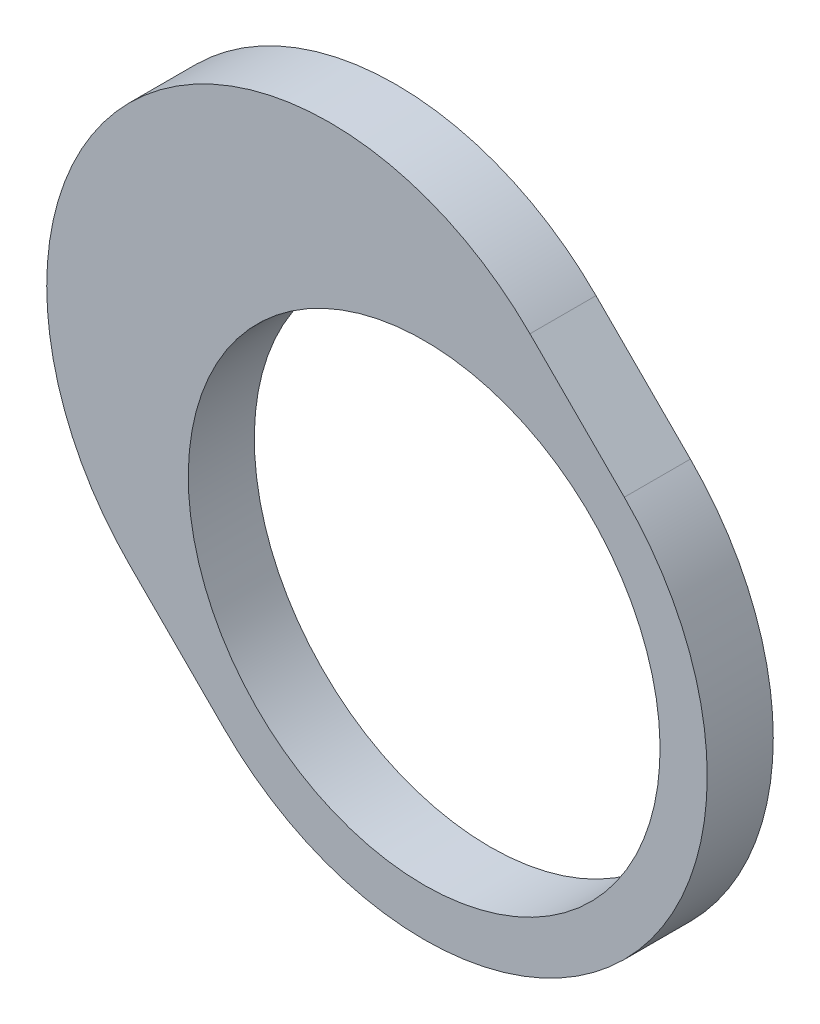
ISO-10303-21;
HEADER;
FILE_DESCRIPTION(('STEP AP214'),'2;1');
FILE_NAME('part.step','',(''),(''),'','','');
FILE_SCHEMA(('AUTOMOTIVE_DESIGN { 1 0 10303 214 1 1 1 1 }'));
ENDSEC;
DATA;
#1=APPLICATION_CONTEXT('core data for automotive mechanical design processes');
#2=APPLICATION_PROTOCOL_DEFINITION('international standard','automotive_design',2000,#1);
#3=PRODUCT_CONTEXT('',#1,'mechanical');
#4=PRODUCT('Part','Part','',(#3));
#5=PRODUCT_RELATED_PRODUCT_CATEGORY('part','',(#4));
#6=PRODUCT_DEFINITION_FORMATION('','',#4);
#7=PRODUCT_DEFINITION_CONTEXT('part definition',#1,'design');
#8=PRODUCT_DEFINITION('design','',#6,#7);
#9=PRODUCT_DEFINITION_SHAPE('','',#8);
#10=(LENGTH_UNIT() NAMED_UNIT(*) SI_UNIT(.MILLI.,.METRE.));
#11=(NAMED_UNIT(*) PLANE_ANGLE_UNIT() SI_UNIT($,.RADIAN.));
#12=(NAMED_UNIT(*) SI_UNIT($,.STERADIAN.) SOLID_ANGLE_UNIT());
#13=UNCERTAINTY_MEASURE_WITH_UNIT(LENGTH_MEASURE(1.E-05),#10,'distance_accuracy_value','');
#14=(GEOMETRIC_REPRESENTATION_CONTEXT(3) GLOBAL_UNCERTAINTY_ASSIGNED_CONTEXT((#13)) GLOBAL_UNIT_ASSIGNED_CONTEXT((#10,
#11,#12)) REPRESENTATION_CONTEXT('',''));
#15=CARTESIAN_POINT('',(0.,0.,0.));
#16=DIRECTION('',(0.,0.,1.));
#17=DIRECTION('',(1.,0.,0.));
#18=AXIS2_PLACEMENT_3D('',#15,#16,#17);
#19=CARTESIAN_POINT('',(124.6,-66.55,-0.045));
#20=DIRECTION('',(0.,0.,-1.));
#21=DIRECTION('',(0.,-1.,0.));
#22=AXIS2_PLACEMENT_3D('',#19,#20,#21);
#23=CYLINDRICAL_SURFACE('',#22,0.125);
#24=CARTESIAN_POINT('',(124.6,-66.55,1.6));
#25=DIRECTION('',(0.,0.,-1.));
#26=DIRECTION('',(0.,-1.,0.));
#27=AXIS2_PLACEMENT_3D('',#24,#25,#26);
#28=CIRCLE('',#27,0.125);
#29=CARTESIAN_POINT('',(124.6,-66.675,1.6));
#30=VERTEX_POINT('',#29);
#31=EDGE_CURVE('E112',#30,#30,#28,.T.);
#32=ORIENTED_EDGE('',*,*,#31,.T.);
#33=DIRECTION('',(0.,0.,1.));
#34=VECTOR('',#33,1.);
#35=CARTESIAN_POINT('',(124.6,-66.675,-0.045));
#36=LINE('',#35,#34);
#37=CARTESIAN_POINT('',(124.6,-66.675,1.635));
#38=VERTEX_POINT('',#37);
#39=EDGE_CURVE('E11',#30,#38,#36,.T.);
#40=ORIENTED_EDGE('',*,*,#39,.T.);
#41=CARTESIAN_POINT('',(124.6,-66.55,1.635));
#42=DIRECTION('',(0.,0.,-1.));
#43=DIRECTION('',(0.,-1.,0.));
#44=AXIS2_PLACEMENT_3D('',#41,#42,#43);
#45=CIRCLE('',#44,0.125);
#46=EDGE_CURVE('E20',#38,#38,#45,.T.);
#47=ORIENTED_EDGE('',*,*,#46,.F.);
#48=ORIENTED_EDGE('',*,*,#39,.F.);
#49=EDGE_LOOP('',(#32,#40,#47,#48));
#50=FACE_BOUND('',#49,.T.);
#51=ADVANCED_FACE('F17',(#50),#23,.F.);
#52=CARTESIAN_POINT('',(124.706066,-66.443933,1.6));
#53=DIRECTION('',(-0.707106781186048,-0.707106781187048,0.));
#54=DIRECTION('',(-0.707106781187048,0.707106781186048,0.));
#55=AXIS2_PLACEMENT_3D('',#52,#53,#54);
#56=PLANE('',#55);
#57=DIRECTION('',(-0.707106781187048,0.707106781186048,0.));
#58=VECTOR('',#57,1.);
#59=CARTESIAN_POINT('',(124.706066,-66.443933,1.6));
#60=LINE('',#59,#58);
#61=CARTESIAN_POINT('',(124.706066,-66.443933,1.6));
#62=VERTEX_POINT('',#61);
#63=CARTESIAN_POINT('',(124.656066,-66.393933,1.6));
#64=VERTEX_POINT('',#63);
#65=EDGE_CURVE('E115',#62,#64,#60,.T.);
#66=ORIENTED_EDGE('',*,*,#65,.T.);
#67=DIRECTION('',(0.,0.,1.));
#68=VECTOR('',#67,1.);
#69=CARTESIAN_POINT('',(124.656066,-66.393933,1.6));
#70=LINE('',#69,#68);
#71=CARTESIAN_POINT('',(124.656066,-66.393933,1.635));
#72=VERTEX_POINT('',#71);
#73=EDGE_CURVE('E84',#64,#72,#70,.T.);
#74=ORIENTED_EDGE('',*,*,#73,.T.);
#75=DIRECTION('',(-0.707106781187048,0.707106781186048,0.));
#76=VECTOR('',#75,1.);
#77=CARTESIAN_POINT('',(124.706066,-66.443933,1.635));
#78=LINE('',#77,#76);
#79=CARTESIAN_POINT('',(124.706066,-66.443933,1.635));
#80=VERTEX_POINT('',#79);
#81=EDGE_CURVE('E114',#80,#72,#78,.T.);
#82=ORIENTED_EDGE('',*,*,#81,.F.);
#83=DIRECTION('',(0.,0.,1.));
#84=VECTOR('',#83,1.);
#85=CARTESIAN_POINT('',(124.706066,-66.443933,1.6));
#86=LINE('',#85,#84);
#87=EDGE_CURVE('E119',#62,#80,#86,.T.);
#88=ORIENTED_EDGE('',*,*,#87,.F.);
#89=EDGE_LOOP('',(#66,#74,#82,#88));
#90=FACE_BOUND('',#89,.T.);
#91=ADVANCED_FACE('F141',(#90),#56,.F.);
#92=CARTESIAN_POINT('',(124.443933,-66.606066,1.635));
#93=DIRECTION('',(0.,0.,1.));
#94=DIRECTION('',(1.,0.,0.));
#95=AXIS2_PLACEMENT_3D('',#92,#93,#94);
#96=PLANE('',#95);
#97=ORIENTED_EDGE('',*,*,#46,.T.);
#98=EDGE_LOOP('',(#97));
#99=FACE_BOUND('',#98,.T.);
#100=DIRECTION('',(0.707106781186548,-0.707106781186548,0.));
#101=VECTOR('',#100,1.);
#102=CARTESIAN_POINT('',(124.443933,-66.606066,1.635));
#103=LINE('',#102,#101);
#104=CARTESIAN_POINT('',(124.443933,-66.606066,1.635));
#105=VERTEX_POINT('',#104);
#106=CARTESIAN_POINT('',(124.493933,-66.656066,1.635));
#107=VERTEX_POINT('',#106);
#108=EDGE_CURVE('E96',#105,#107,#103,.T.);
#109=ORIENTED_EDGE('',*,*,#108,.T.);
#110=CARTESIAN_POINT('',(124.5999995,-66.5499995,1.635));
#111=DIRECTION('',(0.,0.,1.));
#112=DIRECTION('',(-0.707106781186548,-0.707106781186548,0.));
#113=AXIS2_PLACEMENT_3D('',#110,#111,#112);
#114=CIRCLE('',#113,0.150000682813);
#115=EDGE_CURVE('E122',#107,#80,#114,.T.);
#116=ORIENTED_EDGE('',*,*,#115,.T.);
#117=ORIENTED_EDGE('',*,*,#81,.T.);
#118=CARTESIAN_POINT('',(124.5499995,-66.4999995,1.635));
#119=DIRECTION('',(0.,0.,1.));
#120=DIRECTION('',(0.707106781186548,0.707106781186548,0.));
#121=AXIS2_PLACEMENT_3D('',#118,#119,#120);
#122=CIRCLE('',#121,0.150000682813);
#123=EDGE_CURVE('E88',#72,#105,#122,.T.);
#124=ORIENTED_EDGE('',*,*,#123,.T.);
#125=EDGE_LOOP('',(#109,#116,#117,#124));
#126=FACE_BOUND('',#125,.T.);
#127=ADVANCED_FACE('F143',(#99,#126),#96,.T.);
#128=CARTESIAN_POINT('',(124.443933,-66.606066,1.6));
#129=DIRECTION('',(0.,0.,1.));
#130=DIRECTION('',(1.,0.,0.));
#131=AXIS2_PLACEMENT_3D('',#128,#129,#130);
#132=PLANE('',#131);
#133=ORIENTED_EDGE('',*,*,#31,.F.);
#134=EDGE_LOOP('',(#133));
#135=FACE_BOUND('',#134,.T.);
#136=CARTESIAN_POINT('',(124.5499995,-66.4999995,1.6));
#137=DIRECTION('',(0.,0.,1.));
#138=DIRECTION('',(0.707106781186548,0.707106781186548,0.));
#139=AXIS2_PLACEMENT_3D('',#136,#137,#138);
#140=CIRCLE('',#139,0.150000682813);
#141=CARTESIAN_POINT('',(124.443933,-66.606066,1.6));
#142=VERTEX_POINT('',#141);
#143=EDGE_CURVE('E77',#64,#142,#140,.T.);
#144=ORIENTED_EDGE('',*,*,#143,.F.);
#145=ORIENTED_EDGE('',*,*,#65,.F.);
#146=CARTESIAN_POINT('',(124.5999995,-66.5499995,1.6));
#147=DIRECTION('',(0.,0.,1.));
#148=DIRECTION('',(-0.707106781186548,-0.707106781186548,0.));
#149=AXIS2_PLACEMENT_3D('',#146,#147,#148);
#150=CIRCLE('',#149,0.150000682813);
#151=CARTESIAN_POINT('',(124.493933,-66.656066,1.6));
#152=VERTEX_POINT('',#151);
#153=EDGE_CURVE('E101',#152,#62,#150,.T.);
#154=ORIENTED_EDGE('',*,*,#153,.F.);
#155=DIRECTION('',(0.707106781186548,-0.707106781186548,0.));
#156=VECTOR('',#155,1.);
#157=CARTESIAN_POINT('',(124.443933,-66.606066,1.6));
#158=LINE('',#157,#156);
#159=EDGE_CURVE('E94',#142,#152,#158,.T.);
#160=ORIENTED_EDGE('',*,*,#159,.F.);
#161=EDGE_LOOP('',(#144,#145,#154,#160));
#162=FACE_BOUND('',#161,.T.);
#163=ADVANCED_FACE('F99',(#135,#162),#132,.F.);
#164=CARTESIAN_POINT('',(124.5999995,-66.5499995,1.6));
#165=DIRECTION('',(0.,0.,-1.));
#166=DIRECTION('',(-0.707106781186548,-0.707106781186548,0.));
#167=AXIS2_PLACEMENT_3D('',#164,#165,#166);
#168=CYLINDRICAL_SURFACE('',#167,0.150000682813);
#169=ORIENTED_EDGE('',*,*,#153,.T.);
#170=ORIENTED_EDGE('',*,*,#87,.T.);
#171=ORIENTED_EDGE('',*,*,#115,.F.);
#172=DIRECTION('',(0.,0.,1.));
#173=VECTOR('',#172,1.);
#174=CARTESIAN_POINT('',(124.493933,-66.656066,1.6));
#175=LINE('',#174,#173);
#176=EDGE_CURVE('E104',#152,#107,#175,.T.);
#177=ORIENTED_EDGE('',*,*,#176,.F.);
#178=EDGE_LOOP('',(#169,#170,#171,#177));
#179=FACE_BOUND('',#178,.T.);
#180=ADVANCED_FACE('F139',(#179),#168,.T.);
#181=CARTESIAN_POINT('',(124.5499995,-66.4999995,1.6));
#182=DIRECTION('',(0.,0.,-1.));
#183=DIRECTION('',(0.707106781186548,0.707106781186548,0.));
#184=AXIS2_PLACEMENT_3D('',#181,#182,#183);
#185=CYLINDRICAL_SURFACE('',#184,0.150000682813);
#186=ORIENTED_EDGE('',*,*,#143,.T.);
#187=DIRECTION('',(0.,0.,1.));
#188=VECTOR('',#187,1.);
#189=CARTESIAN_POINT('',(124.443933,-66.606066,1.6));
#190=LINE('',#189,#188);
#191=EDGE_CURVE('E81',#142,#105,#190,.T.);
#192=ORIENTED_EDGE('',*,*,#191,.T.);
#193=ORIENTED_EDGE('',*,*,#123,.F.);
#194=ORIENTED_EDGE('',*,*,#73,.F.);
#195=EDGE_LOOP('',(#186,#192,#193,#194));
#196=FACE_BOUND('',#195,.T.);
#197=ADVANCED_FACE('F79',(#196),#185,.T.);
#198=CARTESIAN_POINT('',(124.443933,-66.606066,1.6));
#199=DIRECTION('',(0.707106781186548,0.707106781186548,0.));
#200=DIRECTION('',(0.,0.,-1.));
#201=AXIS2_PLACEMENT_3D('',#198,#199,#200);
#202=PLANE('',#201);
#203=ORIENTED_EDGE('',*,*,#159,.T.);
#204=ORIENTED_EDGE('',*,*,#176,.T.);
#205=ORIENTED_EDGE('',*,*,#108,.F.);
#206=ORIENTED_EDGE('',*,*,#191,.F.);
#207=EDGE_LOOP('',(#203,#204,#205,#206));
#208=FACE_BOUND('',#207,.T.);
#209=ADVANCED_FACE('F92',(#208),#202,.F.);
#210=CLOSED_SHELL('',(#51,#91,#127,#163,#180,#197,#209));
#211=MANIFOLD_SOLID_BREP('B1',#210);
#212=ADVANCED_BREP_SHAPE_REPRESENTATION('',(#18,#211),#14);
#213=SHAPE_DEFINITION_REPRESENTATION(#9,#212);
ENDSEC;
END-ISO-10303-21;
